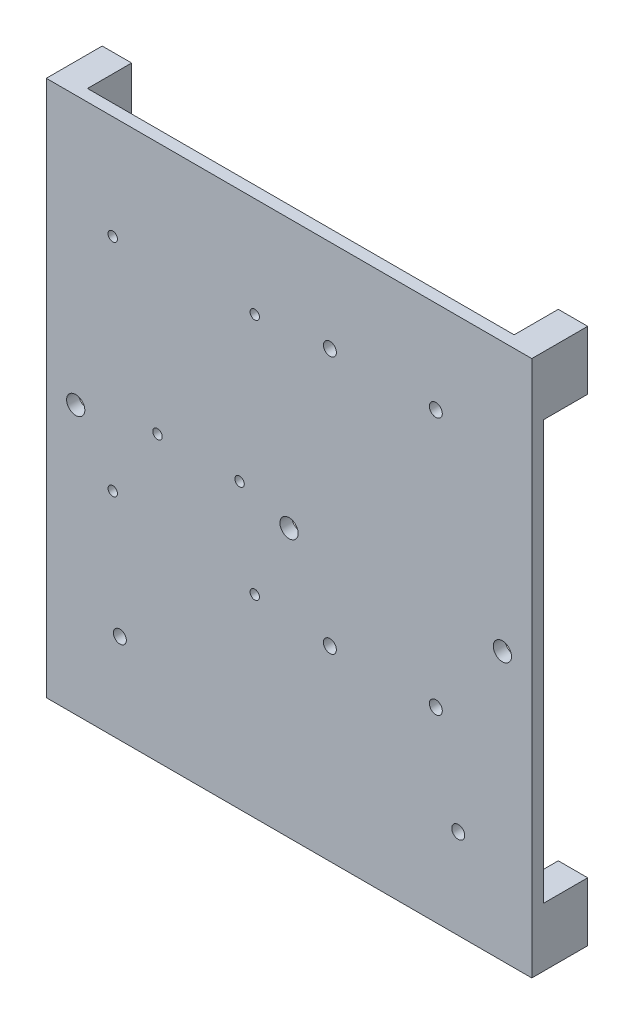
ISO-10303-21;
HEADER;
FILE_DESCRIPTION(('STEP AP214'),'2;1');
FILE_NAME('part.step','',(''),(''),'','','');
FILE_SCHEMA(('AUTOMOTIVE_DESIGN { 1 0 10303 214 1 1 1 1 }'));
ENDSEC;
DATA;
#1=APPLICATION_CONTEXT('core data for automotive mechanical design processes');
#2=APPLICATION_PROTOCOL_DEFINITION('international standard','automotive_design',2000,#1);
#3=PRODUCT_CONTEXT('',#1,'mechanical');
#4=PRODUCT('Part','Part','',(#3));
#5=PRODUCT_RELATED_PRODUCT_CATEGORY('part','',(#4));
#6=PRODUCT_DEFINITION_FORMATION('','',#4);
#7=PRODUCT_DEFINITION_CONTEXT('part definition',#1,'design');
#8=PRODUCT_DEFINITION('design','',#6,#7);
#9=PRODUCT_DEFINITION_SHAPE('','',#8);
#10=(LENGTH_UNIT() NAMED_UNIT(*) SI_UNIT(.MILLI.,.METRE.));
#11=(NAMED_UNIT(*) PLANE_ANGLE_UNIT() SI_UNIT($,.RADIAN.));
#12=(NAMED_UNIT(*) SI_UNIT($,.STERADIAN.) SOLID_ANGLE_UNIT());
#13=UNCERTAINTY_MEASURE_WITH_UNIT(LENGTH_MEASURE(1.E-05),#10,'distance_accuracy_value','');
#14=(GEOMETRIC_REPRESENTATION_CONTEXT(3) GLOBAL_UNCERTAINTY_ASSIGNED_CONTEXT((#13)) GLOBAL_UNIT_ASSIGNED_CONTEXT((#10,
#11,#12)) REPRESENTATION_CONTEXT('',''));
#15=CARTESIAN_POINT('',(0.,0.,0.));
#16=DIRECTION('',(0.,0.,1.));
#17=DIRECTION('',(1.,0.,0.));
#18=AXIS2_PLACEMENT_3D('',#15,#16,#17);
#19=CARTESIAN_POINT('',(0.,0.,0.));
#20=DIRECTION('',(0.,0.,-1.));
#21=DIRECTION('',(-1.,0.,0.));
#22=AXIS2_PLACEMENT_3D('',#19,#20,#21);
#23=PLANE('',#22);
#24=CARTESIAN_POINT('',(72.5,60.655,0.));
#25=DIRECTION('',(0.,0.,-1.));
#26=DIRECTION('',(-1.,0.,0.));
#27=AXIS2_PLACEMENT_3D('',#24,#25,#26);
#28=CIRCLE('',#27,3.1);
#29=CARTESIAN_POINT('',(69.4,60.655,0.));
#30=VERTEX_POINT('',#29);
#31=EDGE_CURVE('E721',#30,#30,#28,.T.);
#32=ORIENTED_EDGE('',*,*,#31,.F.);
#33=EDGE_LOOP('',(#32));
#34=FACE_BOUND('',#33,.T.);
#35=CARTESIAN_POINT('',(-72.5,60.655,0.));
#36=DIRECTION('',(0.,0.,-1.));
#37=DIRECTION('',(-1.,0.,0.));
#38=AXIS2_PLACEMENT_3D('',#35,#36,#37);
#39=CIRCLE('',#38,3.1);
#40=CARTESIAN_POINT('',(-75.6,60.655,0.));
#41=VERTEX_POINT('',#40);
#42=EDGE_CURVE('E728',#41,#41,#39,.T.);
#43=ORIENTED_EDGE('',*,*,#42,.F.);
#44=EDGE_LOOP('',(#43));
#45=FACE_BOUND('',#44,.T.);
#46=CARTESIAN_POINT('',(0.,60.655,0.));
#47=DIRECTION('',(0.,0.,-1.));
#48=DIRECTION('',(-1.,0.,0.));
#49=AXIS2_PLACEMENT_3D('',#46,#47,#48);
#50=CIRCLE('',#49,3.1);
#51=CARTESIAN_POINT('',(-3.09999999999999,60.655,0.));
#52=VERTEX_POINT('',#51);
#53=EDGE_CURVE('E732',#52,#52,#50,.T.);
#54=ORIENTED_EDGE('',*,*,#53,.F.);
#55=EDGE_LOOP('',(#54));
#56=FACE_BOUND('',#55,.T.);
#57=CARTESIAN_POINT('',(-11.655704433472,117.69,0.));
#58=DIRECTION('',(0.,0.,-1.));
#59=DIRECTION('',(-1.,0.,0.));
#60=AXIS2_PLACEMENT_3D('',#57,#58,#59);
#61=CIRCLE('',#60,1.6);
#62=CARTESIAN_POINT('',(-13.255704433472,117.69,0.));
#63=VERTEX_POINT('',#62);
#64=EDGE_CURVE('E261',#63,#63,#61,.T.);
#65=ORIENTED_EDGE('',*,*,#64,.F.);
#66=EDGE_LOOP('',(#65));
#67=FACE_BOUND('',#66,.T.);
#68=CARTESIAN_POINT('',(-16.815704433472,66.,0.));
#69=DIRECTION('',(0.,0.,-1.));
#70=DIRECTION('',(-1.,0.,0.));
#71=AXIS2_PLACEMENT_3D('',#68,#69,#70);
#72=CIRCLE('',#71,1.60000000000001);
#73=CARTESIAN_POINT('',(-18.415704433472,66.,0.));
#74=VERTEX_POINT('',#73);
#75=EDGE_CURVE('E292',#74,#74,#72,.T.);
#76=ORIENTED_EDGE('',*,*,#75,.F.);
#77=EDGE_LOOP('',(#76));
#78=FACE_BOUND('',#77,.T.);
#79=CARTESIAN_POINT('',(-11.655704433472,35.29,0.));
#80=DIRECTION('',(0.,0.,-1.));
#81=DIRECTION('',(-1.,0.,0.));
#82=AXIS2_PLACEMENT_3D('',#79,#80,#81);
#83=CIRCLE('',#82,1.6);
#84=CARTESIAN_POINT('',(-13.255704433472,35.29,0.));
#85=VERTEX_POINT('',#84);
#86=EDGE_CURVE('E286',#85,#85,#83,.T.);
#87=ORIENTED_EDGE('',*,*,#86,.F.);
#88=EDGE_LOOP('',(#87));
#89=FACE_BOUND('',#88,.T.);
#90=CARTESIAN_POINT('',(57.5,0.,0.));
#91=DIRECTION('',(0.,0.,-1.));
#92=DIRECTION('',(-1.,0.,0.));
#93=AXIS2_PLACEMENT_3D('',#90,#91,#92);
#94=CIRCLE('',#93,2.2);
#95=CARTESIAN_POINT('',(55.3,0.,0.));
#96=VERTEX_POINT('',#95);
#97=EDGE_CURVE('E280',#96,#96,#94,.T.);
#98=ORIENTED_EDGE('',*,*,#97,.F.);
#99=EDGE_LOOP('',(#98));
#100=FACE_BOUND('',#99,.T.);
#101=CARTESIAN_POINT('',(49.884295566528,32.9,0.));
#102=DIRECTION('',(0.,0.,-1.));
#103=DIRECTION('',(-1.,0.,0.));
#104=AXIS2_PLACEMENT_3D('',#101,#102,#103);
#105=CIRCLE('',#104,2.19999999999999);
#106=CARTESIAN_POINT('',(47.684295566528,32.9,0.));
#107=VERTEX_POINT('',#106);
#108=EDGE_CURVE('E316',#107,#107,#105,.T.);
#109=ORIENTED_EDGE('',*,*,#108,.F.);
#110=EDGE_LOOP('',(#109));
#111=FACE_BOUND('',#110,.T.);
#112=CARTESIAN_POINT('',(13.884295566528,32.9,0.));
#113=DIRECTION('',(0.,0.,-1.));
#114=DIRECTION('',(-1.,0.,0.));
#115=AXIS2_PLACEMENT_3D('',#112,#113,#114);
#116=CIRCLE('',#115,2.2);
#117=CARTESIAN_POINT('',(11.684295566528,32.9,0.));
#118=VERTEX_POINT('',#117);
#119=EDGE_CURVE('E303',#118,#118,#116,.T.);
#120=ORIENTED_EDGE('',*,*,#119,.F.);
#121=EDGE_LOOP('',(#120));
#122=FACE_BOUND('',#121,.T.);
#123=CARTESIAN_POINT('',(13.884295566528,120.4,0.));
#124=DIRECTION('',(0.,0.,-1.));
#125=DIRECTION('',(-1.,0.,0.));
#126=AXIS2_PLACEMENT_3D('',#123,#124,#125);
#127=CIRCLE('',#126,2.20000000000001);
#128=CARTESIAN_POINT('',(11.684295566528,120.4,0.));
#129=VERTEX_POINT('',#128);
#130=EDGE_CURVE('E304',#129,#129,#127,.T.);
#131=ORIENTED_EDGE('',*,*,#130,.F.);
#132=EDGE_LOOP('',(#131));
#133=FACE_BOUND('',#132,.T.);
#134=CARTESIAN_POINT('',(-57.5,0.,0.));
#135=DIRECTION('',(0.,0.,-1.));
#136=DIRECTION('',(-1.,0.,0.));
#137=AXIS2_PLACEMENT_3D('',#134,#135,#136);
#138=CIRCLE('',#137,2.2);
#139=CARTESIAN_POINT('',(-59.7,0.,0.));
#140=VERTEX_POINT('',#139);
#141=EDGE_CURVE('E279',#140,#140,#138,.T.);
#142=ORIENTED_EDGE('',*,*,#141,.F.);
#143=EDGE_LOOP('',(#142));
#144=FACE_BOUND('',#143,.T.);
#145=CARTESIAN_POINT('',(-59.915704433472,116.57,0.));
#146=DIRECTION('',(0.,0.,-1.));
#147=DIRECTION('',(-1.,0.,0.));
#148=AXIS2_PLACEMENT_3D('',#145,#146,#147);
#149=CIRCLE('',#148,1.6);
#150=CARTESIAN_POINT('',(-61.515704433472,116.57,0.));
#151=VERTEX_POINT('',#150);
#152=EDGE_CURVE('E262',#151,#151,#149,.T.);
#153=ORIENTED_EDGE('',*,*,#152,.F.);
#154=EDGE_LOOP('',(#153));
#155=FACE_BOUND('',#154,.T.);
#156=CARTESIAN_POINT('',(-44.715704433472,66.,0.));
#157=DIRECTION('',(0.,0.,-1.));
#158=DIRECTION('',(-1.,0.,0.));
#159=AXIS2_PLACEMENT_3D('',#156,#157,#158);
#160=CIRCLE('',#159,1.6);
#161=CARTESIAN_POINT('',(-46.315704433472,66.,0.));
#162=VERTEX_POINT('',#161);
#163=EDGE_CURVE('E268',#162,#162,#160,.T.);
#164=ORIENTED_EDGE('',*,*,#163,.F.);
#165=EDGE_LOOP('',(#164));
#166=FACE_BOUND('',#165,.T.);
#167=CARTESIAN_POINT('',(-59.915704433472,41.64,0.));
#168=DIRECTION('',(0.,0.,-1.));
#169=DIRECTION('',(-1.,0.,0.));
#170=AXIS2_PLACEMENT_3D('',#167,#168,#169);
#171=CIRCLE('',#170,1.6);
#172=CARTESIAN_POINT('',(-61.515704433472,41.64,0.));
#173=VERTEX_POINT('',#172);
#174=EDGE_CURVE('E257',#173,#173,#171,.T.);
#175=ORIENTED_EDGE('',*,*,#174,.F.);
#176=EDGE_LOOP('',(#175));
#177=FACE_BOUND('',#176,.T.);
#178=CARTESIAN_POINT('',(49.884295566528,120.4,0.));
#179=DIRECTION('',(0.,0.,-1.));
#180=DIRECTION('',(-1.,0.,0.));
#181=AXIS2_PLACEMENT_3D('',#178,#179,#180);
#182=CIRCLE('',#181,2.19999999999998);
#183=CARTESIAN_POINT('',(47.684295566528,120.4,0.));
#184=VERTEX_POINT('',#183);
#185=EDGE_CURVE('E315',#184,#184,#182,.T.);
#186=ORIENTED_EDGE('',*,*,#185,.F.);
#187=EDGE_LOOP('',(#186));
#188=FACE_BOUND('',#187,.T.);
#189=DIRECTION('',(-1.,0.,0.));
#190=VECTOR('',#189,1.);
#191=CARTESIAN_POINT('',(-82.5,131.81,0.));
#192=LINE('',#191,#190);
#193=CARTESIAN_POINT('',(-72.5,131.81,0.));
#194=VERTEX_POINT('',#193);
#195=CARTESIAN_POINT('',(-82.5,131.81,0.));
#196=VERTEX_POINT('',#195);
#197=EDGE_CURVE('E174',#194,#196,#192,.T.);
#198=ORIENTED_EDGE('',*,*,#197,.F.);
#199=DIRECTION('',(0.,-1.,0.));
#200=VECTOR('',#199,1.);
#201=CARTESIAN_POINT('',(-72.5,151.81,0.));
#202=LINE('',#201,#200);
#203=CARTESIAN_POINT('',(-72.5,151.81,0.));
#204=VERTEX_POINT('',#203);
#205=EDGE_CURVE('E176',#204,#194,#202,.T.);
#206=ORIENTED_EDGE('',*,*,#205,.F.);
#207=DIRECTION('',(-1.,0.,0.));
#208=VECTOR('',#207,1.);
#209=CARTESIAN_POINT('',(-82.5,151.81,0.));
#210=LINE('',#209,#208);
#211=CARTESIAN_POINT('',(72.5,151.81,0.));
#212=VERTEX_POINT('',#211);
#213=EDGE_CURVE('E332',#212,#204,#210,.T.);
#214=ORIENTED_EDGE('',*,*,#213,.F.);
#215=DIRECTION('',(0.,1.,0.));
#216=VECTOR('',#215,1.);
#217=CARTESIAN_POINT('',(72.5,151.81,0.));
#218=LINE('',#217,#216);
#219=CARTESIAN_POINT('',(72.5,131.81,0.));
#220=VERTEX_POINT('',#219);
#221=EDGE_CURVE('E218',#220,#212,#218,.T.);
#222=ORIENTED_EDGE('',*,*,#221,.F.);
#223=DIRECTION('',(-1.,0.,0.));
#224=VECTOR('',#223,1.);
#225=CARTESIAN_POINT('',(82.5,131.81,0.));
#226=LINE('',#225,#224);
#227=CARTESIAN_POINT('',(82.5,131.81,0.));
#228=VERTEX_POINT('',#227);
#229=EDGE_CURVE('E213',#228,#220,#226,.T.);
#230=ORIENTED_EDGE('',*,*,#229,.F.);
#231=DIRECTION('',(0.,1.,0.));
#232=VECTOR('',#231,1.);
#233=CARTESIAN_POINT('',(82.5,-30.5,0.));
#234=LINE('',#233,#232);
#235=CARTESIAN_POINT('',(82.5,-10.5,0.));
#236=VERTEX_POINT('',#235);
#237=EDGE_CURVE('E340',#236,#228,#234,.T.);
#238=ORIENTED_EDGE('',*,*,#237,.F.);
#239=DIRECTION('',(1.,0.,0.));
#240=VECTOR('',#239,1.);
#241=CARTESIAN_POINT('',(82.5,-10.5,0.));
#242=LINE('',#241,#240);
#243=CARTESIAN_POINT('',(72.5,-10.5,0.));
#244=VERTEX_POINT('',#243);
#245=EDGE_CURVE('E238',#244,#236,#242,.T.);
#246=ORIENTED_EDGE('',*,*,#245,.F.);
#247=DIRECTION('',(0.,1.,0.));
#248=VECTOR('',#247,1.);
#249=CARTESIAN_POINT('',(72.5,-30.5,0.));
#250=LINE('',#249,#248);
#251=CARTESIAN_POINT('',(72.5,-30.5,0.));
#252=VERTEX_POINT('',#251);
#253=EDGE_CURVE('E233',#252,#244,#250,.T.);
#254=ORIENTED_EDGE('',*,*,#253,.F.);
#255=DIRECTION('',(1.,0.,0.));
#256=VECTOR('',#255,1.);
#257=CARTESIAN_POINT('',(-82.5,-30.5,0.));
#258=LINE('',#257,#256);
#259=CARTESIAN_POINT('',(-72.5,-30.5,0.));
#260=VERTEX_POINT('',#259);
#261=EDGE_CURVE('E338',#260,#252,#258,.T.);
#262=ORIENTED_EDGE('',*,*,#261,.F.);
#263=DIRECTION('',(0.,-1.,0.));
#264=VECTOR('',#263,1.);
#265=CARTESIAN_POINT('',(-72.5,-30.5,0.));
#266=LINE('',#265,#264);
#267=CARTESIAN_POINT('',(-72.5,-10.5,0.));
#268=VERTEX_POINT('',#267);
#269=EDGE_CURVE('E197',#268,#260,#266,.T.);
#270=ORIENTED_EDGE('',*,*,#269,.F.);
#271=DIRECTION('',(1.,0.,0.));
#272=VECTOR('',#271,1.);
#273=CARTESIAN_POINT('',(-82.5,-10.5,0.));
#274=LINE('',#273,#272);
#275=CARTESIAN_POINT('',(-82.5,-10.5,0.));
#276=VERTEX_POINT('',#275);
#277=EDGE_CURVE('E192',#276,#268,#274,.T.);
#278=ORIENTED_EDGE('',*,*,#277,.F.);
#279=DIRECTION('',(0.,-1.,0.));
#280=VECTOR('',#279,1.);
#281=CARTESIAN_POINT('',(-82.5,-30.5,0.));
#282=LINE('',#281,#280);
#283=EDGE_CURVE('E327',#196,#276,#282,.T.);
#284=ORIENTED_EDGE('',*,*,#283,.F.);
#285=EDGE_LOOP('',(#198,#206,#214,#222,#230,#238,#246,#254,#262,#270,#278,#284));
#286=FACE_BOUND('',#285,.T.);
#287=ADVANCED_FACE('F34',(#34,#45,#56,#67,#78,#89,#100,#111,#122,#133,#144,#155,#166,#177,#188,
#286),#23,.T.);
#288=CARTESIAN_POINT('',(-82.5,-30.5,4.));
#289=DIRECTION('',(1.,0.,0.));
#290=DIRECTION('',(0.,0.,-1.));
#291=AXIS2_PLACEMENT_3D('',#288,#289,#290);
#292=PLANE('',#291);
#293=DIRECTION('',(0.,0.,-1.));
#294=VECTOR('',#293,1.);
#295=CARTESIAN_POINT('',(-82.5,151.81,4.));
#296=LINE('',#295,#294);
#297=CARTESIAN_POINT('',(-82.5,151.81,4.));
#298=VERTEX_POINT('',#297);
#299=CARTESIAN_POINT('',(-82.5,151.81,-15.));
#300=VERTEX_POINT('',#299);
#301=EDGE_CURVE('E150',#298,#300,#296,.T.);
#302=ORIENTED_EDGE('',*,*,#301,.T.);
#303=DIRECTION('',(0.,1.,0.));
#304=VECTOR('',#303,1.);
#305=CARTESIAN_POINT('',(-82.5,151.81,-15.));
#306=LINE('',#305,#304);
#307=CARTESIAN_POINT('',(-82.5,131.81,-15.));
#308=VERTEX_POINT('',#307);
#309=EDGE_CURVE('E154',#308,#300,#306,.T.);
#310=ORIENTED_EDGE('',*,*,#309,.F.);
#311=DIRECTION('',(0.,0.,1.));
#312=VECTOR('',#311,1.);
#313=CARTESIAN_POINT('',(-82.5,131.81,-15.));
#314=LINE('',#313,#312);
#315=EDGE_CURVE('E184',#308,#196,#314,.T.);
#316=ORIENTED_EDGE('',*,*,#315,.T.);
#317=ORIENTED_EDGE('',*,*,#283,.T.);
#318=DIRECTION('',(0.,0.,1.));
#319=VECTOR('',#318,1.);
#320=CARTESIAN_POINT('',(-82.5,-10.5,-15.));
#321=LINE('',#320,#319);
#322=CARTESIAN_POINT('',(-82.5,-10.5,-15.));
#323=VERTEX_POINT('',#322);
#324=EDGE_CURVE('E210',#323,#276,#321,.T.);
#325=ORIENTED_EDGE('',*,*,#324,.F.);
#326=DIRECTION('',(0.,1.,0.));
#327=VECTOR('',#326,1.);
#328=CARTESIAN_POINT('',(-82.5,-30.5,-15.));
#329=LINE('',#328,#327);
#330=CARTESIAN_POINT('',(-82.5,-30.5,-15.));
#331=VERTEX_POINT('',#330);
#332=EDGE_CURVE('E193',#331,#323,#329,.T.);
#333=ORIENTED_EDGE('',*,*,#332,.F.);
#334=DIRECTION('',(0.,0.,-1.));
#335=VECTOR('',#334,1.);
#336=CARTESIAN_POINT('',(-82.5,-30.5,4.));
#337=LINE('',#336,#335);
#338=CARTESIAN_POINT('',(-82.5,-30.5,4.));
#339=VERTEX_POINT('',#338);
#340=EDGE_CURVE('E11',#339,#331,#337,.T.);
#341=ORIENTED_EDGE('',*,*,#340,.F.);
#342=DIRECTION('',(0.,-1.,0.));
#343=VECTOR('',#342,1.);
#344=CARTESIAN_POINT('',(-82.5,-30.5,4.));
#345=LINE('',#344,#343);
#346=EDGE_CURVE('E157',#298,#339,#345,.T.);
#347=ORIENTED_EDGE('',*,*,#346,.F.);
#348=EDGE_LOOP('',(#302,#310,#316,#317,#325,#333,#341,#347));
#349=FACE_BOUND('',#348,.T.);
#350=ADVANCED_FACE('F36',(#349),#292,.F.);
#351=CARTESIAN_POINT('',(-82.5,-30.5,4.));
#352=DIRECTION('',(0.,1.,0.));
#353=DIRECTION('',(0.,0.,1.));
#354=AXIS2_PLACEMENT_3D('',#351,#352,#353);
#355=PLANE('',#354);
#356=ORIENTED_EDGE('',*,*,#340,.T.);
#357=DIRECTION('',(-1.,0.,0.));
#358=VECTOR('',#357,1.);
#359=CARTESIAN_POINT('',(-82.5,-30.5,-15.));
#360=LINE('',#359,#358);
#361=CARTESIAN_POINT('',(-72.5,-30.5,-15.));
#362=VERTEX_POINT('',#361);
#363=EDGE_CURVE('E201',#362,#331,#360,.T.);
#364=ORIENTED_EDGE('',*,*,#363,.F.);
#365=DIRECTION('',(0.,0.,1.));
#366=VECTOR('',#365,1.);
#367=CARTESIAN_POINT('',(-72.5,-30.5,-15.));
#368=LINE('',#367,#366);
#369=EDGE_CURVE('E49',#362,#260,#368,.T.);
#370=ORIENTED_EDGE('',*,*,#369,.T.);
#371=ORIENTED_EDGE('',*,*,#261,.T.);
#372=DIRECTION('',(0.,0.,1.));
#373=VECTOR('',#372,1.);
#374=CARTESIAN_POINT('',(72.5,-30.5,-15.));
#375=LINE('',#374,#373);
#376=CARTESIAN_POINT('',(72.5,-30.5,-15.));
#377=VERTEX_POINT('',#376);
#378=EDGE_CURVE('E254',#377,#252,#375,.T.);
#379=ORIENTED_EDGE('',*,*,#378,.F.);
#380=DIRECTION('',(-1.,0.,0.));
#381=VECTOR('',#380,1.);
#382=CARTESIAN_POINT('',(82.5,-30.5,-15.));
#383=LINE('',#382,#381);
#384=CARTESIAN_POINT('',(82.5,-30.5,-15.));
#385=VERTEX_POINT('',#384);
#386=EDGE_CURVE('E237',#385,#377,#383,.T.);
#387=ORIENTED_EDGE('',*,*,#386,.F.);
#388=DIRECTION('',(0.,0.,-1.));
#389=VECTOR('',#388,1.);
#390=CARTESIAN_POINT('',(82.5,-30.5,4.));
#391=LINE('',#390,#389);
#392=CARTESIAN_POINT('',(82.5,-30.5,4.));
#393=VERTEX_POINT('',#392);
#394=EDGE_CURVE('E42',#393,#385,#391,.T.);
#395=ORIENTED_EDGE('',*,*,#394,.F.);
#396=DIRECTION('',(1.,0.,0.));
#397=VECTOR('',#396,1.);
#398=CARTESIAN_POINT('',(-82.5,-30.5,4.));
#399=LINE('',#398,#397);
#400=EDGE_CURVE('E331',#339,#393,#399,.T.);
#401=ORIENTED_EDGE('',*,*,#400,.F.);
#402=EDGE_LOOP('',(#356,#364,#370,#371,#379,#387,#395,#401));
#403=FACE_BOUND('',#402,.T.);
#404=ADVANCED_FACE('F352',(#403),#355,.F.);
#405=CARTESIAN_POINT('',(82.5,-30.5,4.));
#406=DIRECTION('',(-1.,0.,0.));
#407=DIRECTION('',(0.,0.,1.));
#408=AXIS2_PLACEMENT_3D('',#405,#406,#407);
#409=PLANE('',#408);
#410=ORIENTED_EDGE('',*,*,#394,.T.);
#411=DIRECTION('',(0.,-1.,0.));
#412=VECTOR('',#411,1.);
#413=CARTESIAN_POINT('',(82.5,-30.5,-15.));
#414=LINE('',#413,#412);
#415=CARTESIAN_POINT('',(82.5,-10.5,-15.));
#416=VERTEX_POINT('',#415);
#417=EDGE_CURVE('E234',#416,#385,#414,.T.);
#418=ORIENTED_EDGE('',*,*,#417,.F.);
#419=DIRECTION('',(0.,0.,1.));
#420=VECTOR('',#419,1.);
#421=CARTESIAN_POINT('',(82.5,-10.5,-15.));
#422=LINE('',#421,#420);
#423=EDGE_CURVE('E244',#416,#236,#422,.T.);
#424=ORIENTED_EDGE('',*,*,#423,.T.);
#425=ORIENTED_EDGE('',*,*,#237,.T.);
#426=DIRECTION('',(0.,0.,1.));
#427=VECTOR('',#426,1.);
#428=CARTESIAN_POINT('',(82.5,131.81,-15.));
#429=LINE('',#428,#427);
#430=CARTESIAN_POINT('',(82.5,131.81,-15.));
#431=VERTEX_POINT('',#430);
#432=EDGE_CURVE('E231',#431,#228,#429,.T.);
#433=ORIENTED_EDGE('',*,*,#432,.F.);
#434=DIRECTION('',(0.,-1.,0.));
#435=VECTOR('',#434,1.);
#436=CARTESIAN_POINT('',(82.5,151.81,-15.));
#437=LINE('',#436,#435);
#438=CARTESIAN_POINT('',(82.5,151.81,-15.));
#439=VERTEX_POINT('',#438);
#440=EDGE_CURVE('E214',#439,#431,#437,.T.);
#441=ORIENTED_EDGE('',*,*,#440,.F.);
#442=DIRECTION('',(0.,0.,-1.));
#443=VECTOR('',#442,1.);
#444=CARTESIAN_POINT('',(82.5,151.81,4.));
#445=LINE('',#444,#443);
#446=CARTESIAN_POINT('',(82.5,151.81,4.));
#447=VERTEX_POINT('',#446);
#448=EDGE_CURVE('E159',#447,#439,#445,.T.);
#449=ORIENTED_EDGE('',*,*,#448,.F.);
#450=DIRECTION('',(0.,1.,0.));
#451=VECTOR('',#450,1.);
#452=CARTESIAN_POINT('',(82.5,-30.5,4.));
#453=LINE('',#452,#451);
#454=EDGE_CURVE('E334',#393,#447,#453,.T.);
#455=ORIENTED_EDGE('',*,*,#454,.F.);
#456=EDGE_LOOP('',(#410,#418,#424,#425,#433,#441,#449,#455));
#457=FACE_BOUND('',#456,.T.);
#458=ADVANCED_FACE('F349',(#457),#409,.F.);
#459=CARTESIAN_POINT('',(-82.5,151.81,4.));
#460=DIRECTION('',(0.,-1.,0.));
#461=DIRECTION('',(0.,0.,-1.));
#462=AXIS2_PLACEMENT_3D('',#459,#460,#461);
#463=PLANE('',#462);
#464=ORIENTED_EDGE('',*,*,#448,.T.);
#465=DIRECTION('',(1.,0.,0.));
#466=VECTOR('',#465,1.);
#467=CARTESIAN_POINT('',(82.5,151.81,-15.));
#468=LINE('',#467,#466);
#469=CARTESIAN_POINT('',(72.5,151.81,-15.));
#470=VERTEX_POINT('',#469);
#471=EDGE_CURVE('E222',#470,#439,#468,.T.);
#472=ORIENTED_EDGE('',*,*,#471,.F.);
#473=DIRECTION('',(0.,0.,1.));
#474=VECTOR('',#473,1.);
#475=CARTESIAN_POINT('',(72.5,151.81,-15.));
#476=LINE('',#475,#474);
#477=EDGE_CURVE('E57',#470,#212,#476,.T.);
#478=ORIENTED_EDGE('',*,*,#477,.T.);
#479=ORIENTED_EDGE('',*,*,#213,.T.);
#480=DIRECTION('',(0.,0.,1.));
#481=VECTOR('',#480,1.);
#482=CARTESIAN_POINT('',(-72.5,151.81,-15.));
#483=LINE('',#482,#481);
#484=CARTESIAN_POINT('',(-72.5,151.81,-15.));
#485=VERTEX_POINT('',#484);
#486=EDGE_CURVE('E165',#485,#204,#483,.T.);
#487=ORIENTED_EDGE('',*,*,#486,.F.);
#488=DIRECTION('',(1.,0.,0.));
#489=VECTOR('',#488,1.);
#490=CARTESIAN_POINT('',(-82.5,151.81,-15.));
#491=LINE('',#490,#489);
#492=EDGE_CURVE('E163',#300,#485,#491,.T.);
#493=ORIENTED_EDGE('',*,*,#492,.F.);
#494=ORIENTED_EDGE('',*,*,#301,.F.);
#495=DIRECTION('',(-1.,0.,0.));
#496=VECTOR('',#495,1.);
#497=CARTESIAN_POINT('',(-82.5,151.81,4.));
#498=LINE('',#497,#496);
#499=EDGE_CURVE('E160',#447,#298,#498,.T.);
#500=ORIENTED_EDGE('',*,*,#499,.F.);
#501=EDGE_LOOP('',(#464,#472,#478,#479,#487,#493,#494,#500));
#502=FACE_BOUND('',#501,.T.);
#503=ADVANCED_FACE('F164',(#502),#463,.F.);
#504=CARTESIAN_POINT('',(0.,0.,4.));
#505=DIRECTION('',(0.,0.,-1.));
#506=DIRECTION('',(-1.,0.,0.));
#507=AXIS2_PLACEMENT_3D('',#504,#505,#506);
#508=PLANE('',#507);
#509=CARTESIAN_POINT('',(72.5,60.655,4.));
#510=DIRECTION('',(0.,0.,-1.));
#511=DIRECTION('',(-1.,0.,0.));
#512=AXIS2_PLACEMENT_3D('',#509,#510,#511);
#513=CIRCLE('',#512,3.1);
#514=CARTESIAN_POINT('',(69.4,60.655,4.));
#515=VERTEX_POINT('',#514);
#516=EDGE_CURVE('E185',#515,#515,#513,.F.);
#517=ORIENTED_EDGE('',*,*,#516,.F.);
#518=EDGE_LOOP('',(#517));
#519=FACE_BOUND('',#518,.T.);
#520=CARTESIAN_POINT('',(-72.5,60.655,4.));
#521=DIRECTION('',(0.,0.,-1.));
#522=DIRECTION('',(-1.,0.,0.));
#523=AXIS2_PLACEMENT_3D('',#520,#521,#522);
#524=CIRCLE('',#523,3.1);
#525=CARTESIAN_POINT('',(-75.6,60.655,4.));
#526=VERTEX_POINT('',#525);
#527=EDGE_CURVE('E725',#526,#526,#524,.F.);
#528=ORIENTED_EDGE('',*,*,#527,.F.);
#529=EDGE_LOOP('',(#528));
#530=FACE_BOUND('',#529,.T.);
#531=CARTESIAN_POINT('',(0.,60.655,4.));
#532=DIRECTION('',(0.,0.,-1.));
#533=DIRECTION('',(-1.,0.,0.));
#534=AXIS2_PLACEMENT_3D('',#531,#532,#533);
#535=CIRCLE('',#534,3.1);
#536=CARTESIAN_POINT('',(-3.09999999999999,60.655,4.));
#537=VERTEX_POINT('',#536);
#538=EDGE_CURVE('E179',#537,#537,#535,.F.);
#539=ORIENTED_EDGE('',*,*,#538,.F.);
#540=EDGE_LOOP('',(#539));
#541=FACE_BOUND('',#540,.T.);
#542=CARTESIAN_POINT('',(-11.655704433472,117.69,4.));
#543=DIRECTION('',(0.,0.,-1.));
#544=DIRECTION('',(-1.,0.,0.));
#545=AXIS2_PLACEMENT_3D('',#542,#543,#544);
#546=CIRCLE('',#545,1.6);
#547=CARTESIAN_POINT('',(-13.255704433472,117.69,4.));
#548=VERTEX_POINT('',#547);
#549=EDGE_CURVE('E295',#548,#548,#546,.T.);
#550=ORIENTED_EDGE('',*,*,#549,.T.);
#551=EDGE_LOOP('',(#550));
#552=FACE_BOUND('',#551,.T.);
#553=CARTESIAN_POINT('',(-16.815704433472,66.,4.));
#554=DIRECTION('',(0.,0.,-1.));
#555=DIRECTION('',(-1.,0.,0.));
#556=AXIS2_PLACEMENT_3D('',#553,#554,#555);
#557=CIRCLE('',#556,1.60000000000001);
#558=CARTESIAN_POINT('',(-18.415704433472,66.,4.));
#559=VERTEX_POINT('',#558);
#560=EDGE_CURVE('E289',#559,#559,#557,.T.);
#561=ORIENTED_EDGE('',*,*,#560,.T.);
#562=EDGE_LOOP('',(#561));
#563=FACE_BOUND('',#562,.T.);
#564=CARTESIAN_POINT('',(-11.655704433472,35.29,4.));
#565=DIRECTION('',(0.,0.,-1.));
#566=DIRECTION('',(-1.,0.,0.));
#567=AXIS2_PLACEMENT_3D('',#564,#565,#566);
#568=CIRCLE('',#567,1.6);
#569=CARTESIAN_POINT('',(-13.255704433472,35.29,4.));
#570=VERTEX_POINT('',#569);
#571=EDGE_CURVE('E283',#570,#570,#568,.T.);
#572=ORIENTED_EDGE('',*,*,#571,.T.);
#573=EDGE_LOOP('',(#572));
#574=FACE_BOUND('',#573,.T.);
#575=CARTESIAN_POINT('',(57.5,0.,4.));
#576=DIRECTION('',(0.,0.,-1.));
#577=DIRECTION('',(-1.,0.,0.));
#578=AXIS2_PLACEMENT_3D('',#575,#576,#577);
#579=CIRCLE('',#578,2.2);
#580=CARTESIAN_POINT('',(55.3,0.,4.));
#581=VERTEX_POINT('',#580);
#582=EDGE_CURVE('E276',#581,#581,#579,.T.);
#583=ORIENTED_EDGE('',*,*,#582,.T.);
#584=EDGE_LOOP('',(#583));
#585=FACE_BOUND('',#584,.T.);
#586=CARTESIAN_POINT('',(49.884295566528,32.9,4.));
#587=DIRECTION('',(0.,0.,-1.));
#588=DIRECTION('',(-1.,0.,0.));
#589=AXIS2_PLACEMENT_3D('',#586,#587,#588);
#590=CIRCLE('',#589,2.19999999999999);
#591=CARTESIAN_POINT('',(47.684295566528,32.9,4.));
#592=VERTEX_POINT('',#591);
#593=EDGE_CURVE('E312',#592,#592,#590,.T.);
#594=ORIENTED_EDGE('',*,*,#593,.T.);
#595=EDGE_LOOP('',(#594));
#596=FACE_BOUND('',#595,.T.);
#597=CARTESIAN_POINT('',(13.884295566528,32.9,4.));
#598=DIRECTION('',(0.,0.,-1.));
#599=DIRECTION('',(-1.,0.,0.));
#600=AXIS2_PLACEMENT_3D('',#597,#598,#599);
#601=CIRCLE('',#600,2.2);
#602=CARTESIAN_POINT('',(11.684295566528,32.9,4.));
#603=VERTEX_POINT('',#602);
#604=EDGE_CURVE('E319',#603,#603,#601,.T.);
#605=ORIENTED_EDGE('',*,*,#604,.T.);
#606=EDGE_LOOP('',(#605));
#607=FACE_BOUND('',#606,.T.);
#608=CARTESIAN_POINT('',(13.884295566528,120.4,4.));
#609=DIRECTION('',(0.,0.,-1.));
#610=DIRECTION('',(-1.,0.,0.));
#611=AXIS2_PLACEMENT_3D('',#608,#609,#610);
#612=CIRCLE('',#611,2.20000000000001);
#613=CARTESIAN_POINT('',(11.684295566528,120.4,4.));
#614=VERTEX_POINT('',#613);
#615=EDGE_CURVE('E300',#614,#614,#612,.T.);
#616=ORIENTED_EDGE('',*,*,#615,.T.);
#617=EDGE_LOOP('',(#616));
#618=FACE_BOUND('',#617,.T.);
#619=CARTESIAN_POINT('',(-57.5,0.,4.));
#620=DIRECTION('',(0.,0.,-1.));
#621=DIRECTION('',(-1.,0.,0.));
#622=AXIS2_PLACEMENT_3D('',#619,#620,#621);
#623=CIRCLE('',#622,2.2);
#624=CARTESIAN_POINT('',(-59.7,0.,4.));
#625=VERTEX_POINT('',#624);
#626=EDGE_CURVE('E307',#625,#625,#623,.T.);
#627=ORIENTED_EDGE('',*,*,#626,.T.);
#628=EDGE_LOOP('',(#627));
#629=FACE_BOUND('',#628,.T.);
#630=CARTESIAN_POINT('',(-59.915704433472,116.57,4.));
#631=DIRECTION('',(0.,0.,-1.));
#632=DIRECTION('',(-1.,0.,0.));
#633=AXIS2_PLACEMENT_3D('',#630,#631,#632);
#634=CIRCLE('',#633,1.6);
#635=CARTESIAN_POINT('',(-61.515704433472,116.57,4.));
#636=VERTEX_POINT('',#635);
#637=EDGE_CURVE('E258',#636,#636,#634,.T.);
#638=ORIENTED_EDGE('',*,*,#637,.T.);
#639=EDGE_LOOP('',(#638));
#640=FACE_BOUND('',#639,.T.);
#641=CARTESIAN_POINT('',(-44.715704433472,66.,4.));
#642=DIRECTION('',(0.,0.,-1.));
#643=DIRECTION('',(-1.,0.,0.));
#644=AXIS2_PLACEMENT_3D('',#641,#642,#643);
#645=CIRCLE('',#644,1.6);
#646=CARTESIAN_POINT('',(-46.315704433472,66.,4.));
#647=VERTEX_POINT('',#646);
#648=EDGE_CURVE('E265',#647,#647,#645,.T.);
#649=ORIENTED_EDGE('',*,*,#648,.T.);
#650=EDGE_LOOP('',(#649));
#651=FACE_BOUND('',#650,.T.);
#652=CARTESIAN_POINT('',(-59.915704433472,41.64,4.));
#653=DIRECTION('',(0.,0.,-1.));
#654=DIRECTION('',(-1.,0.,0.));
#655=AXIS2_PLACEMENT_3D('',#652,#653,#654);
#656=CIRCLE('',#655,1.6);
#657=CARTESIAN_POINT('',(-61.515704433472,41.64,4.));
#658=VERTEX_POINT('',#657);
#659=EDGE_CURVE('E271',#658,#658,#656,.T.);
#660=ORIENTED_EDGE('',*,*,#659,.T.);
#661=EDGE_LOOP('',(#660));
#662=FACE_BOUND('',#661,.T.);
#663=CARTESIAN_POINT('',(49.884295566528,120.4,4.));
#664=DIRECTION('',(0.,0.,-1.));
#665=DIRECTION('',(-1.,0.,0.));
#666=AXIS2_PLACEMENT_3D('',#663,#664,#665);
#667=CIRCLE('',#666,2.19999999999998);
#668=CARTESIAN_POINT('',(47.684295566528,120.4,4.));
#669=VERTEX_POINT('',#668);
#670=EDGE_CURVE('E324',#669,#669,#667,.T.);
#671=ORIENTED_EDGE('',*,*,#670,.T.);
#672=EDGE_LOOP('',(#671));
#673=FACE_BOUND('',#672,.T.);
#674=ORIENTED_EDGE('',*,*,#346,.T.);
#675=ORIENTED_EDGE('',*,*,#400,.T.);
#676=ORIENTED_EDGE('',*,*,#454,.T.);
#677=ORIENTED_EDGE('',*,*,#499,.T.);
#678=EDGE_LOOP('',(#674,#675,#676,#677));
#679=FACE_BOUND('',#678,.T.);
#680=ADVANCED_FACE('F378',(#519,#530,#541,#552,#563,#574,#585,#596,#607,#618,#629,#640,#651,
#662,#673,#679),#508,.F.);
#681=CARTESIAN_POINT('',(49.884295566528,120.4,4.));
#682=DIRECTION('',(0.,0.,-1.));
#683=DIRECTION('',(-1.,0.,0.));
#684=AXIS2_PLACEMENT_3D('',#681,#682,#683);
#685=CYLINDRICAL_SURFACE('',#684,2.19999999999998);
#686=ORIENTED_EDGE('',*,*,#670,.F.);
#687=EDGE_LOOP('',(#686));
#688=FACE_BOUND('',#687,.T.);
#689=ORIENTED_EDGE('',*,*,#185,.T.);
#690=EDGE_LOOP('',(#689));
#691=FACE_BOUND('',#690,.T.);
#692=ADVANCED_FACE('F436',(#688,#691),#685,.F.);
#693=CARTESIAN_POINT('',(-59.915704433472,41.64,4.));
#694=DIRECTION('',(0.,0.,-1.));
#695=DIRECTION('',(-1.,0.,0.));
#696=AXIS2_PLACEMENT_3D('',#693,#694,#695);
#697=CYLINDRICAL_SURFACE('',#696,1.6);
#698=ORIENTED_EDGE('',*,*,#659,.F.);
#699=EDGE_LOOP('',(#698));
#700=FACE_BOUND('',#699,.T.);
#701=ORIENTED_EDGE('',*,*,#174,.T.);
#702=EDGE_LOOP('',(#701));
#703=FACE_BOUND('',#702,.T.);
#704=ADVANCED_FACE('F444',(#700,#703),#697,.F.);
#705=CARTESIAN_POINT('',(-44.715704433472,66.,4.));
#706=DIRECTION('',(0.,0.,-1.));
#707=DIRECTION('',(-1.,0.,0.));
#708=AXIS2_PLACEMENT_3D('',#705,#706,#707);
#709=CYLINDRICAL_SURFACE('',#708,1.6);
#710=ORIENTED_EDGE('',*,*,#648,.F.);
#711=EDGE_LOOP('',(#710));
#712=FACE_BOUND('',#711,.T.);
#713=ORIENTED_EDGE('',*,*,#163,.T.);
#714=EDGE_LOOP('',(#713));
#715=FACE_BOUND('',#714,.T.);
#716=ADVANCED_FACE('F451',(#712,#715),#709,.F.);
#717=CARTESIAN_POINT('',(-59.915704433472,116.57,4.));
#718=DIRECTION('',(0.,0.,-1.));
#719=DIRECTION('',(-1.,0.,0.));
#720=AXIS2_PLACEMENT_3D('',#717,#718,#719);
#721=CYLINDRICAL_SURFACE('',#720,1.6);
#722=ORIENTED_EDGE('',*,*,#637,.F.);
#723=EDGE_LOOP('',(#722));
#724=FACE_BOUND('',#723,.T.);
#725=ORIENTED_EDGE('',*,*,#152,.T.);
#726=EDGE_LOOP('',(#725));
#727=FACE_BOUND('',#726,.T.);
#728=ADVANCED_FACE('F459',(#724,#727),#721,.F.);
#729=CARTESIAN_POINT('',(-57.5,0.,4.));
#730=DIRECTION('',(0.,0.,-1.));
#731=DIRECTION('',(-1.,0.,0.));
#732=AXIS2_PLACEMENT_3D('',#729,#730,#731);
#733=CYLINDRICAL_SURFACE('',#732,2.2);
#734=ORIENTED_EDGE('',*,*,#626,.F.);
#735=EDGE_LOOP('',(#734));
#736=FACE_BOUND('',#735,.T.);
#737=ORIENTED_EDGE('',*,*,#141,.T.);
#738=EDGE_LOOP('',(#737));
#739=FACE_BOUND('',#738,.T.);
#740=ADVANCED_FACE('F467',(#736,#739),#733,.F.);
#741=CARTESIAN_POINT('',(13.884295566528,120.4,4.));
#742=DIRECTION('',(0.,0.,-1.));
#743=DIRECTION('',(-1.,0.,0.));
#744=AXIS2_PLACEMENT_3D('',#741,#742,#743);
#745=CYLINDRICAL_SURFACE('',#744,2.20000000000001);
#746=ORIENTED_EDGE('',*,*,#615,.F.);
#747=EDGE_LOOP('',(#746));
#748=FACE_BOUND('',#747,.T.);
#749=ORIENTED_EDGE('',*,*,#130,.T.);
#750=EDGE_LOOP('',(#749));
#751=FACE_BOUND('',#750,.T.);
#752=ADVANCED_FACE('F475',(#748,#751),#745,.F.);
#753=CARTESIAN_POINT('',(13.884295566528,32.9,4.));
#754=DIRECTION('',(0.,0.,-1.));
#755=DIRECTION('',(-1.,0.,0.));
#756=AXIS2_PLACEMENT_3D('',#753,#754,#755);
#757=CYLINDRICAL_SURFACE('',#756,2.2);
#758=ORIENTED_EDGE('',*,*,#604,.F.);
#759=EDGE_LOOP('',(#758));
#760=FACE_BOUND('',#759,.T.);
#761=ORIENTED_EDGE('',*,*,#119,.T.);
#762=EDGE_LOOP('',(#761));
#763=FACE_BOUND('',#762,.T.);
#764=ADVANCED_FACE('F483',(#760,#763),#757,.F.);
#765=CARTESIAN_POINT('',(49.884295566528,32.9,4.));
#766=DIRECTION('',(0.,0.,-1.));
#767=DIRECTION('',(-1.,0.,0.));
#768=AXIS2_PLACEMENT_3D('',#765,#766,#767);
#769=CYLINDRICAL_SURFACE('',#768,2.19999999999999);
#770=ORIENTED_EDGE('',*,*,#593,.F.);
#771=EDGE_LOOP('',(#770));
#772=FACE_BOUND('',#771,.T.);
#773=ORIENTED_EDGE('',*,*,#108,.T.);
#774=EDGE_LOOP('',(#773));
#775=FACE_BOUND('',#774,.T.);
#776=ADVANCED_FACE('F491',(#772,#775),#769,.F.);
#777=CARTESIAN_POINT('',(57.5,0.,4.));
#778=DIRECTION('',(0.,0.,-1.));
#779=DIRECTION('',(-1.,0.,0.));
#780=AXIS2_PLACEMENT_3D('',#777,#778,#779);
#781=CYLINDRICAL_SURFACE('',#780,2.2);
#782=ORIENTED_EDGE('',*,*,#582,.F.);
#783=EDGE_LOOP('',(#782));
#784=FACE_BOUND('',#783,.T.);
#785=ORIENTED_EDGE('',*,*,#97,.T.);
#786=EDGE_LOOP('',(#785));
#787=FACE_BOUND('',#786,.T.);
#788=ADVANCED_FACE('F499',(#784,#787),#781,.F.);
#789=CARTESIAN_POINT('',(-11.655704433472,35.29,4.));
#790=DIRECTION('',(0.,0.,-1.));
#791=DIRECTION('',(-1.,0.,0.));
#792=AXIS2_PLACEMENT_3D('',#789,#790,#791);
#793=CYLINDRICAL_SURFACE('',#792,1.6);
#794=ORIENTED_EDGE('',*,*,#571,.F.);
#795=EDGE_LOOP('',(#794));
#796=FACE_BOUND('',#795,.T.);
#797=ORIENTED_EDGE('',*,*,#86,.T.);
#798=EDGE_LOOP('',(#797));
#799=FACE_BOUND('',#798,.T.);
#800=ADVANCED_FACE('F507',(#796,#799),#793,.F.);
#801=CARTESIAN_POINT('',(-16.815704433472,66.,4.));
#802=DIRECTION('',(0.,0.,-1.));
#803=DIRECTION('',(-1.,0.,0.));
#804=AXIS2_PLACEMENT_3D('',#801,#802,#803);
#805=CYLINDRICAL_SURFACE('',#804,1.60000000000001);
#806=ORIENTED_EDGE('',*,*,#560,.F.);
#807=EDGE_LOOP('',(#806));
#808=FACE_BOUND('',#807,.T.);
#809=ORIENTED_EDGE('',*,*,#75,.T.);
#810=EDGE_LOOP('',(#809));
#811=FACE_BOUND('',#810,.T.);
#812=ADVANCED_FACE('F515',(#808,#811),#805,.F.);
#813=CARTESIAN_POINT('',(-11.655704433472,117.69,4.));
#814=DIRECTION('',(0.,0.,-1.));
#815=DIRECTION('',(-1.,0.,0.));
#816=AXIS2_PLACEMENT_3D('',#813,#814,#815);
#817=CYLINDRICAL_SURFACE('',#816,1.6);
#818=ORIENTED_EDGE('',*,*,#549,.F.);
#819=EDGE_LOOP('',(#818));
#820=FACE_BOUND('',#819,.T.);
#821=ORIENTED_EDGE('',*,*,#64,.T.);
#822=EDGE_LOOP('',(#821));
#823=FACE_BOUND('',#822,.T.);
#824=ADVANCED_FACE('F523',(#820,#823),#817,.F.);
#825=CARTESIAN_POINT('',(72.5,-30.5,-15.));
#826=DIRECTION('',(1.,0.,0.));
#827=DIRECTION('',(0.,0.,-1.));
#828=AXIS2_PLACEMENT_3D('',#825,#826,#827);
#829=PLANE('',#828);
#830=ORIENTED_EDGE('',*,*,#253,.T.);
#831=DIRECTION('',(0.,0.,1.));
#832=VECTOR('',#831,1.);
#833=CARTESIAN_POINT('',(72.5,-10.5,-15.));
#834=LINE('',#833,#832);
#835=CARTESIAN_POINT('',(72.5,-10.5,-15.));
#836=VERTEX_POINT('',#835);
#837=EDGE_CURVE('E251',#836,#244,#834,.T.);
#838=ORIENTED_EDGE('',*,*,#837,.F.);
#839=DIRECTION('',(0.,1.,0.));
#840=VECTOR('',#839,1.);
#841=CARTESIAN_POINT('',(72.5,-30.5,-15.));
#842=LINE('',#841,#840);
#843=EDGE_CURVE('E240',#377,#836,#842,.T.);
#844=ORIENTED_EDGE('',*,*,#843,.F.);
#845=ORIENTED_EDGE('',*,*,#378,.T.);
#846=EDGE_LOOP('',(#830,#838,#844,#845));
#847=FACE_BOUND('',#846,.T.);
#848=ADVANCED_FACE('F531',(#847),#829,.F.);
#849=CARTESIAN_POINT('',(82.5,-10.5,-15.));
#850=DIRECTION('',(0.,-1.,0.));
#851=DIRECTION('',(0.,0.,-1.));
#852=AXIS2_PLACEMENT_3D('',#849,#850,#851);
#853=PLANE('',#852);
#854=ORIENTED_EDGE('',*,*,#245,.T.);
#855=ORIENTED_EDGE('',*,*,#423,.F.);
#856=DIRECTION('',(1.,0.,0.));
#857=VECTOR('',#856,1.);
#858=CARTESIAN_POINT('',(82.5,-10.5,-15.));
#859=LINE('',#858,#857);
#860=EDGE_CURVE('E242',#836,#416,#859,.T.);
#861=ORIENTED_EDGE('',*,*,#860,.F.);
#862=ORIENTED_EDGE('',*,*,#837,.T.);
#863=EDGE_LOOP('',(#854,#855,#861,#862));
#864=FACE_BOUND('',#863,.T.);
#865=ADVANCED_FACE('F360',(#864),#853,.F.);
#866=CARTESIAN_POINT('',(0.,0.,-15.));
#867=DIRECTION('',(0.,0.,1.));
#868=DIRECTION('',(1.,0.,0.));
#869=AXIS2_PLACEMENT_3D('',#866,#867,#868);
#870=PLANE('',#869);
#871=ORIENTED_EDGE('',*,*,#417,.T.);
#872=ORIENTED_EDGE('',*,*,#386,.T.);
#873=ORIENTED_EDGE('',*,*,#843,.T.);
#874=ORIENTED_EDGE('',*,*,#860,.T.);
#875=EDGE_LOOP('',(#871,#872,#873,#874));
#876=FACE_BOUND('',#875,.T.);
#877=ADVANCED_FACE('F355',(#876),#870,.F.);
#878=CARTESIAN_POINT('',(82.5,131.81,-15.));
#879=DIRECTION('',(0.,1.,0.));
#880=DIRECTION('',(0.,0.,1.));
#881=AXIS2_PLACEMENT_3D('',#878,#879,#880);
#882=PLANE('',#881);
#883=ORIENTED_EDGE('',*,*,#229,.T.);
#884=DIRECTION('',(0.,0.,1.));
#885=VECTOR('',#884,1.);
#886=CARTESIAN_POINT('',(72.5,131.81,-15.));
#887=LINE('',#886,#885);
#888=CARTESIAN_POINT('',(72.5,131.81,-15.));
#889=VERTEX_POINT('',#888);
#890=EDGE_CURVE('E228',#889,#220,#887,.T.);
#891=ORIENTED_EDGE('',*,*,#890,.F.);
#892=DIRECTION('',(-1.,0.,0.));
#893=VECTOR('',#892,1.);
#894=CARTESIAN_POINT('',(82.5,131.81,-15.));
#895=LINE('',#894,#893);
#896=EDGE_CURVE('E217',#431,#889,#895,.T.);
#897=ORIENTED_EDGE('',*,*,#896,.F.);
#898=ORIENTED_EDGE('',*,*,#432,.T.);
#899=EDGE_LOOP('',(#883,#891,#897,#898));
#900=FACE_BOUND('',#899,.T.);
#901=ADVANCED_FACE('F371',(#900),#882,.F.);
#902=CARTESIAN_POINT('',(72.5,151.81,-15.));
#903=DIRECTION('',(1.,0.,0.));
#904=DIRECTION('',(0.,0.,-1.));
#905=AXIS2_PLACEMENT_3D('',#902,#903,#904);
#906=PLANE('',#905);
#907=ORIENTED_EDGE('',*,*,#221,.T.);
#908=ORIENTED_EDGE('',*,*,#477,.F.);
#909=DIRECTION('',(0.,1.,0.));
#910=VECTOR('',#909,1.);
#911=CARTESIAN_POINT('',(72.5,151.81,-15.));
#912=LINE('',#911,#910);
#913=EDGE_CURVE('E220',#889,#470,#912,.T.);
#914=ORIENTED_EDGE('',*,*,#913,.F.);
#915=ORIENTED_EDGE('',*,*,#890,.T.);
#916=EDGE_LOOP('',(#907,#908,#914,#915));
#917=FACE_BOUND('',#916,.T.);
#918=ADVANCED_FACE('F374',(#917),#906,.F.);
#919=CARTESIAN_POINT('',(0.,0.,-15.));
#920=DIRECTION('',(0.,0.,-1.));
#921=DIRECTION('',(-1.,0.,0.));
#922=AXIS2_PLACEMENT_3D('',#919,#920,#921);
#923=PLANE('',#922);
#924=ORIENTED_EDGE('',*,*,#440,.T.);
#925=ORIENTED_EDGE('',*,*,#896,.T.);
#926=ORIENTED_EDGE('',*,*,#913,.T.);
#927=ORIENTED_EDGE('',*,*,#471,.T.);
#928=EDGE_LOOP('',(#924,#925,#926,#927));
#929=FACE_BOUND('',#928,.T.);
#930=ADVANCED_FACE('F376',(#929),#923,.T.);
#931=CARTESIAN_POINT('',(-82.5,-10.5,-15.));
#932=DIRECTION('',(0.,-1.,0.));
#933=DIRECTION('',(1.,0.,0.));
#934=AXIS2_PLACEMENT_3D('',#931,#932,#933);
#935=PLANE('',#934);
#936=ORIENTED_EDGE('',*,*,#277,.T.);
#937=DIRECTION('',(0.,0.,1.));
#938=VECTOR('',#937,1.);
#939=CARTESIAN_POINT('',(-72.5,-10.5,-15.));
#940=LINE('',#939,#938);
#941=CARTESIAN_POINT('',(-72.5,-10.5,-15.));
#942=VERTEX_POINT('',#941);
#943=EDGE_CURVE('E207',#942,#268,#940,.T.);
#944=ORIENTED_EDGE('',*,*,#943,.F.);
#945=DIRECTION('',(1.,0.,0.));
#946=VECTOR('',#945,1.);
#947=CARTESIAN_POINT('',(-82.5,-10.5,-15.));
#948=LINE('',#947,#946);
#949=EDGE_CURVE('E196',#323,#942,#948,.T.);
#950=ORIENTED_EDGE('',*,*,#949,.F.);
#951=ORIENTED_EDGE('',*,*,#324,.T.);
#952=EDGE_LOOP('',(#936,#944,#950,#951));
#953=FACE_BOUND('',#952,.T.);
#954=ADVANCED_FACE('F387',(#953),#935,.F.);
#955=CARTESIAN_POINT('',(-72.5,-30.5,-15.));
#956=DIRECTION('',(-1.,0.,0.));
#957=DIRECTION('',(0.,0.,1.));
#958=AXIS2_PLACEMENT_3D('',#955,#956,#957);
#959=PLANE('',#958);
#960=ORIENTED_EDGE('',*,*,#269,.T.);
#961=ORIENTED_EDGE('',*,*,#369,.F.);
#962=DIRECTION('',(0.,-1.,0.));
#963=VECTOR('',#962,1.);
#964=CARTESIAN_POINT('',(-72.5,-30.5,-15.));
#965=LINE('',#964,#963);
#966=EDGE_CURVE('E199',#942,#362,#965,.T.);
#967=ORIENTED_EDGE('',*,*,#966,.F.);
#968=ORIENTED_EDGE('',*,*,#943,.T.);
#969=EDGE_LOOP('',(#960,#961,#967,#968));
#970=FACE_BOUND('',#969,.T.);
#971=ADVANCED_FACE('F392',(#970),#959,.F.);
#972=CARTESIAN_POINT('',(0.,0.,-15.));
#973=DIRECTION('',(0.,0.,-1.));
#974=DIRECTION('',(-1.,0.,0.));
#975=AXIS2_PLACEMENT_3D('',#972,#973,#974);
#976=PLANE('',#975);
#977=ORIENTED_EDGE('',*,*,#332,.T.);
#978=ORIENTED_EDGE('',*,*,#949,.T.);
#979=ORIENTED_EDGE('',*,*,#966,.T.);
#980=ORIENTED_EDGE('',*,*,#363,.T.);
#981=EDGE_LOOP('',(#977,#978,#979,#980));
#982=FACE_BOUND('',#981,.T.);
#983=ADVANCED_FACE('F381',(#982),#976,.T.);
#984=CARTESIAN_POINT('',(-72.5,151.81,-15.));
#985=DIRECTION('',(-1.,0.,0.));
#986=DIRECTION('',(0.,0.,1.));
#987=AXIS2_PLACEMENT_3D('',#984,#985,#986);
#988=PLANE('',#987);
#989=ORIENTED_EDGE('',*,*,#205,.T.);
#990=DIRECTION('',(0.,0.,1.));
#991=VECTOR('',#990,1.);
#992=CARTESIAN_POINT('',(-72.5,131.81,-15.));
#993=LINE('',#992,#991);
#994=CARTESIAN_POINT('',(-72.5,131.81,-15.));
#995=VERTEX_POINT('',#994);
#996=EDGE_CURVE('E188',#995,#194,#993,.T.);
#997=ORIENTED_EDGE('',*,*,#996,.F.);
#998=DIRECTION('',(0.,-1.,0.));
#999=VECTOR('',#998,1.);
#1000=CARTESIAN_POINT('',(-72.5,151.81,-15.));
#1001=LINE('',#1000,#999);
#1002=EDGE_CURVE('E168',#485,#995,#1001,.T.);
#1003=ORIENTED_EDGE('',*,*,#1002,.F.);
#1004=ORIENTED_EDGE('',*,*,#486,.T.);
#1005=EDGE_LOOP('',(#989,#997,#1003,#1004));
#1006=FACE_BOUND('',#1005,.T.);
#1007=ADVANCED_FACE('F399',(#1006),#988,.F.);
#1008=CARTESIAN_POINT('',(-82.5,131.81,-15.));
#1009=DIRECTION('',(0.,1.,0.));
#1010=DIRECTION('',(0.,0.,1.));
#1011=AXIS2_PLACEMENT_3D('',#1008,#1009,#1010);
#1012=PLANE('',#1011);
#1013=ORIENTED_EDGE('',*,*,#197,.T.);
#1014=ORIENTED_EDGE('',*,*,#315,.F.);
#1015=DIRECTION('',(-1.,0.,0.));
#1016=VECTOR('',#1015,1.);
#1017=CARTESIAN_POINT('',(-82.5,131.81,-15.));
#1018=LINE('',#1017,#1016);
#1019=EDGE_CURVE('E172',#995,#308,#1018,.T.);
#1020=ORIENTED_EDGE('',*,*,#1019,.F.);
#1021=ORIENTED_EDGE('',*,*,#996,.T.);
#1022=EDGE_LOOP('',(#1013,#1014,#1020,#1021));
#1023=FACE_BOUND('',#1022,.T.);
#1024=ADVANCED_FACE('F592',(#1023),#1012,.F.);
#1025=CARTESIAN_POINT('',(0.,0.,-15.));
#1026=DIRECTION('',(0.,0.,1.));
#1027=DIRECTION('',(1.,0.,0.));
#1028=AXIS2_PLACEMENT_3D('',#1025,#1026,#1027);
#1029=PLANE('',#1028);
#1030=ORIENTED_EDGE('',*,*,#309,.T.);
#1031=ORIENTED_EDGE('',*,*,#492,.T.);
#1032=ORIENTED_EDGE('',*,*,#1002,.T.);
#1033=ORIENTED_EDGE('',*,*,#1019,.T.);
#1034=EDGE_LOOP('',(#1030,#1031,#1032,#1033));
#1035=FACE_BOUND('',#1034,.T.);
#1036=ADVANCED_FACE('F170',(#1035),#1029,.F.);
#1037=CARTESIAN_POINT('',(0.,60.655,4.001));
#1038=DIRECTION('',(0.,0.,-1.));
#1039=DIRECTION('',(-1.,0.,0.));
#1040=AXIS2_PLACEMENT_3D('',#1037,#1038,#1039);
#1041=CYLINDRICAL_SURFACE('',#1040,3.1);
#1042=ORIENTED_EDGE('',*,*,#53,.T.);
#1043=EDGE_LOOP('',(#1042));
#1044=FACE_BOUND('',#1043,.T.);
#1045=ORIENTED_EDGE('',*,*,#538,.T.);
#1046=EDGE_LOOP('',(#1045));
#1047=FACE_BOUND('',#1046,.T.);
#1048=ADVANCED_FACE('F610',(#1044,#1047),#1041,.F.);
#1049=CARTESIAN_POINT('',(-72.5,60.655,4.001));
#1050=DIRECTION('',(0.,0.,-1.));
#1051=DIRECTION('',(-1.,0.,0.));
#1052=AXIS2_PLACEMENT_3D('',#1049,#1050,#1051);
#1053=CYLINDRICAL_SURFACE('',#1052,3.1);
#1054=ORIENTED_EDGE('',*,*,#42,.T.);
#1055=EDGE_LOOP('',(#1054));
#1056=FACE_BOUND('',#1055,.T.);
#1057=ORIENTED_EDGE('',*,*,#527,.T.);
#1058=EDGE_LOOP('',(#1057));
#1059=FACE_BOUND('',#1058,.T.);
#1060=ADVANCED_FACE('F695',(#1056,#1059),#1053,.F.);
#1061=CARTESIAN_POINT('',(72.5,60.655,4.001));
#1062=DIRECTION('',(0.,0.,-1.));
#1063=DIRECTION('',(-1.,0.,0.));
#1064=AXIS2_PLACEMENT_3D('',#1061,#1062,#1063);
#1065=CYLINDRICAL_SURFACE('',#1064,3.1);
#1066=ORIENTED_EDGE('',*,*,#31,.T.);
#1067=EDGE_LOOP('',(#1066));
#1068=FACE_BOUND('',#1067,.T.);
#1069=ORIENTED_EDGE('',*,*,#516,.T.);
#1070=EDGE_LOOP('',(#1069));
#1071=FACE_BOUND('',#1070,.T.);
#1072=ADVANCED_FACE('F702',(#1068,#1071),#1065,.F.);
#1073=CLOSED_SHELL('',(#287,#350,#404,#458,#503,#680,#692,#704,#716,#728,#740,#752,#764,#776,
#788,#800,#812,#824,#848,#865,#877,#901,#918,#930,#954,#971,#983,#1007,#1024,#1036,#1048,#1060,#1072));
#1074=MANIFOLD_SOLID_BREP('B2',#1073);
#1075=ADVANCED_BREP_SHAPE_REPRESENTATION('',(#18,#1074),#14);
#1076=SHAPE_DEFINITION_REPRESENTATION(#9,#1075);
ENDSEC;
END-ISO-10303-21;
